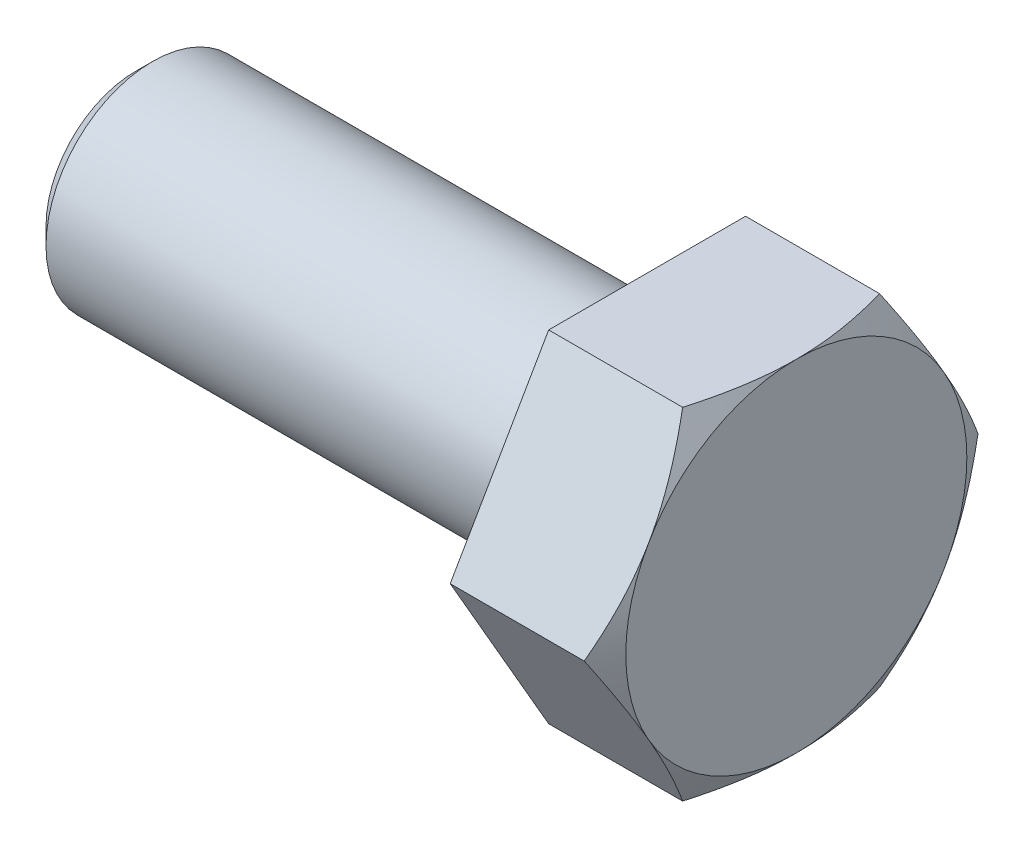
ISO-10303-21;
HEADER;
FILE_DESCRIPTION(('STEP AP214'),'2;1');
FILE_NAME('part.step','',(''),(''),'','','');
FILE_SCHEMA(('AUTOMOTIVE_DESIGN { 1 0 10303 214 1 1 1 1 }'));
ENDSEC;
DATA;
#1=APPLICATION_CONTEXT('core data for automotive mechanical design processes');
#2=APPLICATION_PROTOCOL_DEFINITION('international standard','automotive_design',2000,#1);
#3=PRODUCT_CONTEXT('',#1,'mechanical');
#4=PRODUCT('Part','Part','',(#3));
#5=PRODUCT_RELATED_PRODUCT_CATEGORY('part','',(#4));
#6=PRODUCT_DEFINITION_FORMATION('','',#4);
#7=PRODUCT_DEFINITION_CONTEXT('part definition',#1,'design');
#8=PRODUCT_DEFINITION('design','',#6,#7);
#9=PRODUCT_DEFINITION_SHAPE('','',#8);
#10=(LENGTH_UNIT() NAMED_UNIT(*) SI_UNIT(.MILLI.,.METRE.));
#11=(NAMED_UNIT(*) PLANE_ANGLE_UNIT() SI_UNIT($,.RADIAN.));
#12=(NAMED_UNIT(*) SI_UNIT($,.STERADIAN.) SOLID_ANGLE_UNIT());
#13=UNCERTAINTY_MEASURE_WITH_UNIT(LENGTH_MEASURE(1.E-05),#10,'distance_accuracy_value','');
#14=(GEOMETRIC_REPRESENTATION_CONTEXT(3) GLOBAL_UNCERTAINTY_ASSIGNED_CONTEXT((#13)) GLOBAL_UNIT_ASSIGNED_CONTEXT((#10,
#11,#12)) REPRESENTATION_CONTEXT('',''));
#15=CARTESIAN_POINT('',(0.,0.,0.));
#16=DIRECTION('',(0.,0.,1.));
#17=DIRECTION('',(1.,0.,0.));
#18=AXIS2_PLACEMENT_3D('',#15,#16,#17);
#19=CARTESIAN_POINT('',(0.,0.,0.));
#20=DIRECTION('',(1.,0.,0.));
#21=DIRECTION('',(0.,0.,-1.));
#22=AXIS2_PLACEMENT_3D('',#19,#20,#21);
#23=CYLINDRICAL_SURFACE('',#22,2.1);
#24=CARTESIAN_POINT('',(0.,0.,0.));
#25=DIRECTION('',(1.,0.,0.));
#26=DIRECTION('',(0.,0.,1.));
#27=AXIS2_PLACEMENT_3D('',#24,#25,#26);
#28=CIRCLE('',#27,2.1);
#29=CARTESIAN_POINT('',(0.,0.,2.1));
#30=VERTEX_POINT('',#29);
#31=EDGE_CURVE('P0_E11',#30,#30,#28,.T.);
#32=ORIENTED_EDGE('',*,*,#31,.T.);
#33=CARTESIAN_POINT('',(12.,0.,2.1));
#34=DIRECTION('',(-1.,0.,0.));
#35=VECTOR('',#34,1.);
#36=LINE('',#33,#35);
#37=CARTESIAN_POINT('',(12.,0.,2.1));
#38=VERTEX_POINT('',#37);
#39=EDGE_CURVE('P0_E24',#38,#30,#36,.T.);
#40=ORIENTED_EDGE('',*,*,#39,.F.);
#41=CARTESIAN_POINT('',(12.,0.,0.));
#42=DIRECTION('',(-1.,0.,0.));
#43=DIRECTION('',(0.,0.,1.));
#44=AXIS2_PLACEMENT_3D('',#41,#42,#43);
#45=CIRCLE('',#44,2.1);
#46=EDGE_CURVE('P0_E33',#38,#38,#45,.T.);
#47=ORIENTED_EDGE('',*,*,#46,.T.);
#48=ORIENTED_EDGE('',*,*,#39,.T.);
#49=EDGE_LOOP('',(#32,#40,#47,#48));
#50=FACE_BOUND('',#49,.T.);
#51=ADVANCED_FACE('P0_F16',(#50),#23,.T.);
#52=OPEN_SHELL('',(#51));
#53=SHELL_BASED_SURFACE_MODEL('P0_B1',(#52));
#54=CARTESIAN_POINT('',(15.5,0.,0.));
#55=DIRECTION('',(1.,0.,0.));
#56=DIRECTION('',(0.,1.,0.));
#57=AXIS2_PLACEMENT_3D('',#54,#55,#56);
#58=PLANE('',#57);
#59=CARTESIAN_POINT('',(15.4999999999745,0.,0.));
#60=DIRECTION('',(-1.,0.,0.));
#61=DIRECTION('',(0.,0.,1.));
#62=AXIS2_PLACEMENT_3D('',#59,#60,#61);
#63=CIRCLE('',#62,4.00000000004094);
#64=CARTESIAN_POINT('',(15.4999999999745,-4.00000000002047,-4.08001245358839E-08));
#65=VERTEX_POINT('',#64);
#66=CARTESIAN_POINT('',(15.4999999999745,-2.00000000025329,3.46410161501512));
#67=VERTEX_POINT('',#66);
#68=EDGE_CURVE('P1_E103',#65,#67,#63,.T.);
#69=ORIENTED_EDGE('',*,*,#68,.F.);
#70=CARTESIAN_POINT('',(15.4999999999745,0.,0.));
#71=DIRECTION('',(-1.,0.,0.));
#72=DIRECTION('',(0.,0.,1.));
#73=AXIS2_PLACEMENT_3D('',#70,#71,#72);
#74=CIRCLE('',#73,4.00000000004094);
#75=CARTESIAN_POINT('',(15.4999999999745,-2.00000002440245,-3.4641016010729));
#76=VERTEX_POINT('',#75);
#77=EDGE_CURVE('P1_E11',#76,#65,#74,.T.);
#78=ORIENTED_EDGE('',*,*,#77,.F.);
#79=CARTESIAN_POINT('',(15.4999999999745,0.,0.));
#80=DIRECTION('',(-1.,0.,0.));
#81=DIRECTION('',(0.,0.,1.));
#82=AXIS2_PLACEMENT_3D('',#79,#80,#81);
#83=CIRCLE('',#82,4.00000000004094);
#84=CARTESIAN_POINT('',(15.4999999999745,2.00000000025931,-3.46410161501165));
#85=VERTEX_POINT('',#84);
#86=EDGE_CURVE('P1_E30',#85,#76,#83,.T.);
#87=ORIENTED_EDGE('',*,*,#86,.F.);
#88=CARTESIAN_POINT('',(15.4999999999745,0.,0.));
#89=DIRECTION('',(-1.,0.,0.));
#90=DIRECTION('',(0.,0.,1.));
#91=AXIS2_PLACEMENT_3D('',#88,#89,#90);
#92=CIRCLE('',#91,4.00000000004094);
#93=CARTESIAN_POINT('',(15.4999999999745,4.00000000002047,-1.98022594919469E-11));
#94=VERTEX_POINT('',#93);
#95=EDGE_CURVE('P1_E161',#94,#85,#92,.T.);
#96=ORIENTED_EDGE('',*,*,#95,.F.);
#97=CARTESIAN_POINT('',(15.4999999999745,0.,0.));
#98=DIRECTION('',(-1.,0.,0.));
#99=DIRECTION('',(0.,0.,1.));
#100=AXIS2_PLACEMENT_3D('',#97,#98,#99);
#101=CIRCLE('',#100,4.00000000004094);
#102=CARTESIAN_POINT('',(15.4999999999745,2.00000003113124,3.46410159718804));
#103=VERTEX_POINT('',#102);
#104=EDGE_CURVE('P1_E112',#103,#94,#101,.T.);
#105=ORIENTED_EDGE('',*,*,#104,.F.);
#106=CARTESIAN_POINT('',(15.4999999999745,0.,0.));
#107=DIRECTION('',(-1.,0.,0.));
#108=DIRECTION('',(0.,0.,1.));
#109=AXIS2_PLACEMENT_3D('',#106,#107,#108);
#110=CIRCLE('',#109,4.00000000004094);
#111=EDGE_CURVE('P1_E208',#67,#103,#110,.T.);
#112=ORIENTED_EDGE('',*,*,#111,.F.);
#113=EDGE_LOOP('',(#69,#78,#87,#96,#105,#112));
#114=FACE_BOUND('',#113,.T.);
#115=ADVANCED_FACE('P1_F17',(#114),#58,.T.);
#116=CARTESIAN_POINT('',(15.140590816543,0.,0.));
#117=DIRECTION('',(-1.,0.,0.));
#118=DIRECTION('',(0.,0.,1.));
#119=AXIS2_PLACEMENT_3D('',#116,#117,#118);
#120=CONICAL_SURFACE('',#119,4.62251496641922,1.0471975511743);
#121=CARTESIAN_POINT('',(15.1427344100675,-4.,-2.30940107677274));
#122=CARTESIAN_POINT('',(15.4999999936864,-4.,-1.07179679159493));
#123=CARTESIAN_POINT('',(15.4999999999982,-4.,-4.08001136873754E-08));
#124=(BOUNDED_CURVE() B_SPLINE_CURVE(2,(#121,#122,#123),.UNSPECIFIED.,.F.,
.F.) B_SPLINE_CURVE_WITH_KNOTS((3,3),(0.740616445840215,1.19730458523065),
.UNSPECIFIED.) CURVE() GEOMETRIC_REPRESENTATION_ITEM() RATIONAL_B_SPLINE_CURVE((1.83253175468209,
1.97427857650898,1.97427857920692)) REPRESENTATION_ITEM(''));
#125=CARTESIAN_POINT('',(15.1427344100722,-4.,-2.30940107675653));
#126=VERTEX_POINT('',#125);
#127=EDGE_CURVE('P1_E293',#126,#65,#124,.T.);
#128=ORIENTED_EDGE('',*,*,#127,.F.);
#129=CARTESIAN_POINT('',(15.4999999999979,-2.00000002439234,-3.46410160105538));
#130=CARTESIAN_POINT('',(15.4999999956407,-2.92820324335333,-2.92820322272555));
#131=CARTESIAN_POINT('',(15.1427344100665,-4.00000000001487,-2.30940107675042));
#132=(BOUNDED_CURVE() B_SPLINE_CURVE(2,(#129,#130,#131),.UNSPECIFIED.,.F.,
.F.) B_SPLINE_CURVE_WITH_KNOTS((3,3),(1.1973045999236,1.65399274200623),
.UNSPECIFIED.) CURVE() GEOMETRIC_REPRESENTATION_ITEM() RATIONAL_B_SPLINE_CURVE((1.97427857920674,
1.97427857734428,1.83253175468168)) REPRESENTATION_ITEM(''));
#133=EDGE_CURVE('P1_E236',#76,#126,#132,.T.);
#134=ORIENTED_EDGE('',*,*,#133,.F.);
#135=ORIENTED_EDGE('',*,*,#77,.T.);
#136=EDGE_LOOP('',(#128,#134,#135));
#137=FACE_BOUND('',#136,.T.);
#138=ADVANCED_FACE('P1_F340',(#137),#120,.T.);
#139=CARTESIAN_POINT('',(15.140590816543,0.,0.));
#140=DIRECTION('',(-1.,0.,0.));
#141=DIRECTION('',(0.,-3.48139460559074E-09,-1.));
#142=AXIS2_PLACEMENT_3D('',#139,#140,#141);
#143=CONICAL_SURFACE('',#142,4.62251496641922,1.0471975511743);
#144=CARTESIAN_POINT('',(15.4999999999982,2.00000000027226,-3.46410161498051));
#145=CARTESIAN_POINT('',(15.5000000000468,1.07179676986435,-3.99999999991922));
#146=CARTESIAN_POINT('',(15.1427344100666,-1.50662984120474E-11,-4.6188021535257));
#147=(BOUNDED_CURVE() B_SPLINE_CURVE(2,(#144,#145,#146),.UNSPECIFIED.,.F.,
.F.) B_SPLINE_CURVE_WITH_KNOTS((3,3),(1.19730459385607,1.65399274200641),
.UNSPECIFIED.) CURVE() GEOMETRIC_REPRESENTATION_ITEM() RATIONAL_B_SPLINE_CURVE((1.97427857920694,
1.97427857922773,1.83253175468176)) REPRESENTATION_ITEM(''));
#148=CARTESIAN_POINT('',(15.1427344100722,-2.28304729963317E-12,-4.61880215351598));
#149=VERTEX_POINT('',#148);
#150=EDGE_CURVE('P1_E176',#85,#149,#147,.T.);
#151=ORIENTED_EDGE('',*,*,#150,.F.);
#152=ORIENTED_EDGE('',*,*,#86,.T.);
#153=CARTESIAN_POINT('',(15.1427344100674,1.15974947017943E-11,-4.6188021535243));
#154=CARTESIAN_POINT('',(15.5000000043551,-1.07179678279165,-3.99999999245625));
#155=CARTESIAN_POINT('',(15.4999999999979,-2.00000002439234,-3.46410160105538));
#156=(BOUNDED_CURVE() B_SPLINE_CURVE(2,(#153,#154,#155),.UNSPECIFIED.,.F.,
.F.) B_SPLINE_CURVE_WITH_KNOTS((3,3),(0.740616445840306,1.1973045999236),
.UNSPECIFIED.) CURVE() GEOMETRIC_REPRESENTATION_ITEM() RATIONAL_B_SPLINE_CURVE((1.83253175468201,
1.97427858106921,1.97427857920674)) REPRESENTATION_ITEM(''));
#157=EDGE_CURVE('P1_E179',#149,#76,#156,.T.);
#158=ORIENTED_EDGE('',*,*,#157,.F.);
#159=EDGE_LOOP('',(#151,#152,#158));
#160=FACE_BOUND('',#159,.T.);
#161=ADVANCED_FACE('P1_F177',(#160),#143,.T.);
#162=CARTESIAN_POINT('',(15.140590816543,0.,0.));
#163=DIRECTION('',(-1.,0.,0.));
#164=DIRECTION('',(0.,0.,1.));
#165=AXIS2_PLACEMENT_3D('',#162,#163,#164);
#166=CONICAL_SURFACE('',#165,4.62251496641922,1.0471975511743);
#167=CARTESIAN_POINT('',(15.4999999999982,4.,-2.93993260822995E-11));
#168=CARTESIAN_POINT('',(15.4999999999936,4.,-1.07179676974724));
#169=CARTESIAN_POINT('',(15.1427344100666,4.,-2.30940107677591));
#170=(BOUNDED_CURVE() B_SPLINE_CURVE(2,(#167,#168,#169),.UNSPECIFIED.,.F.,
.F.) B_SPLINE_CURVE_WITH_KNOTS((3,3),(1.19730459392929,1.65399274200639),
.UNSPECIFIED.) CURVE() GEOMETRIC_REPRESENTATION_ITEM() RATIONAL_B_SPLINE_CURVE((1.97427857920692,
1.97427857920498,1.83253175468176)) REPRESENTATION_ITEM(''));
#171=CARTESIAN_POINT('',(15.1427344100723,3.99999999999776,-2.30940107675999));
#172=VERTEX_POINT('',#171);
#173=EDGE_CURVE('P1_E171',#94,#172,#170,.T.);
#174=ORIENTED_EDGE('',*,*,#173,.F.);
#175=ORIENTED_EDGE('',*,*,#95,.T.);
#176=CARTESIAN_POINT('',(15.1427344100677,4.0000000000117,-2.30940107675164));
#177=CARTESIAN_POINT('',(15.4999999999496,2.92820323042612,-2.92820323018847));
#178=CARTESIAN_POINT('',(15.4999999999982,2.00000000027226,-3.46410161498051));
#179=(BOUNDED_CURVE() B_SPLINE_CURVE(2,(#176,#177,#178),.UNSPECIFIED.,.F.,
.F.) B_SPLINE_CURVE_WITH_KNOTS((3,3),(0.740616445840341,1.19730459385607),
.UNSPECIFIED.) CURVE() GEOMETRIC_REPRESENTATION_ITEM() RATIONAL_B_SPLINE_CURVE((1.83253175468219,
1.97427857918615,1.97427857920694)) REPRESENTATION_ITEM(''));
#180=EDGE_CURVE('P1_E170',#172,#85,#179,.T.);
#181=ORIENTED_EDGE('',*,*,#180,.F.);
#182=EDGE_LOOP('',(#174,#175,#181));
#183=FACE_BOUND('',#182,.T.);
#184=ADVANCED_FACE('P1_F168',(#183),#166,.T.);
#185=CARTESIAN_POINT('',(15.140590816543,0.,0.));
#186=DIRECTION('',(-1.,0.,0.));
#187=DIRECTION('',(0.,0.,1.));
#188=AXIS2_PLACEMENT_3D('',#185,#186,#187);
#189=CONICAL_SURFACE('',#188,4.62251496641922,1.0471975511743);
#190=CARTESIAN_POINT('',(15.1427344100675,4.,2.30940107677274));
#191=CARTESIAN_POINT('',(15.5000000000027,4.,1.07179676971446));
#192=CARTESIAN_POINT('',(15.4999999999982,4.,-2.93993260822995E-11));
#193=(BOUNDED_CURVE() B_SPLINE_CURVE(2,(#190,#191,#192),.UNSPECIFIED.,.F.,
.F.) B_SPLINE_CURVE_WITH_KNOTS((3,3),(0.740616445840215,1.19730459392929),
.UNSPECIFIED.) CURVE() GEOMETRIC_REPRESENTATION_ITEM() RATIONAL_B_SPLINE_CURVE((1.83253175468209,
1.97427857920886,1.97427857920692)) REPRESENTATION_ITEM(''));
#194=CARTESIAN_POINT('',(15.1427344100722,4.,2.30940107675653));
#195=VERTEX_POINT('',#194);
#196=EDGE_CURVE('P1_E273',#195,#94,#193,.T.);
#197=ORIENTED_EDGE('',*,*,#196,.F.);
#198=CARTESIAN_POINT('',(15.4999999999979,2.00000003112112,3.46410159717052));
#199=CARTESIAN_POINT('',(15.4999999944387,2.92820324695928,2.92820322064366));
#200=CARTESIAN_POINT('',(15.1427344100665,4.00000000001487,2.30940107675042));
#201=(BOUNDED_CURVE() B_SPLINE_CURVE(2,(#198,#199,#200),.UNSPECIFIED.,.F.,
.F.) B_SPLINE_CURVE_WITH_KNOTS((3,3),(1.19730460157893,1.65399274200623),
.UNSPECIFIED.) CURVE() GEOMETRIC_REPRESENTATION_ITEM() RATIONAL_B_SPLINE_CURVE((1.97427857920674,
1.9742785768305,1.83253175468168)) REPRESENTATION_ITEM(''));
#202=EDGE_CURVE('P1_E258',#103,#195,#201,.T.);
#203=ORIENTED_EDGE('',*,*,#202,.F.);
#204=ORIENTED_EDGE('',*,*,#104,.T.);
#205=EDGE_LOOP('',(#197,#203,#204));
#206=FACE_BOUND('',#205,.T.);
#207=ADVANCED_FACE('P1_F354',(#206),#189,.T.);
#208=CARTESIAN_POINT('',(15.140590816543,0.,0.));
#209=DIRECTION('',(-1.,0.,0.));
#210=DIRECTION('',(0.,0.,1.));
#211=AXIS2_PLACEMENT_3D('',#208,#209,#210);
#212=CONICAL_SURFACE('',#211,4.62251496641922,1.0471975511743);
#213=CARTESIAN_POINT('',(15.4999999999982,-4.,-4.08001136873754E-08));
#214=CARTESIAN_POINT('',(15.50000000631,-4.,1.07179674786572));
#215=CARTESIAN_POINT('',(15.1427344100673,-4.,2.3094010767733));
#216=(BOUNDED_CURVE() B_SPLINE_CURVE(2,(#213,#214,#215),.UNSPECIFIED.,.F.,
.F.) B_SPLINE_CURVE_WITH_KNOTS((3,3),(1.19730458523065,1.65399274200594),
.UNSPECIFIED.) CURVE() GEOMETRIC_REPRESENTATION_ITEM() RATIONAL_B_SPLINE_CURVE((1.97427857920692,
1.97427858190486,1.83253175468203)) REPRESENTATION_ITEM(''));
#217=CARTESIAN_POINT('',(15.142734410073,-3.99999999999776,2.30940107675739));
#218=VERTEX_POINT('',#217);
#219=EDGE_CURVE('P1_E137',#65,#218,#216,.T.);
#220=ORIENTED_EDGE('',*,*,#219,.F.);
#221=ORIENTED_EDGE('',*,*,#68,.T.);
#222=CARTESIAN_POINT('',(15.1427344100674,-4.00000000001257,2.30940107675114));
#223=CARTESIAN_POINT('',(15.4999999999512,-2.92820323042168,2.92820323019104));
#224=CARTESIAN_POINT('',(15.4999999999982,-2.00000000026334,3.46410161498566));
#225=(BOUNDED_CURVE() B_SPLINE_CURVE(2,(#222,#223,#224),.UNSPECIFIED.,.F.,
.F.) B_SPLINE_CURVE_WITH_KNOTS((3,3),(0.740616445840171,1.19730459385826),
.UNSPECIFIED.) CURVE() GEOMETRIC_REPRESENTATION_ITEM() RATIONAL_B_SPLINE_CURVE((1.83253175468208,
1.97427857918684,1.97427857920694)) REPRESENTATION_ITEM(''));
#226=EDGE_CURVE('P1_E249',#218,#67,#225,.T.);
#227=ORIENTED_EDGE('',*,*,#226,.F.);
#228=EDGE_LOOP('',(#220,#221,#227));
#229=FACE_BOUND('',#228,.T.);
#230=ADVANCED_FACE('P1_F356',(#229),#212,.T.);
#231=CARTESIAN_POINT('',(0.,0.,0.));
#232=DIRECTION('',(-1.,0.,0.));
#233=DIRECTION('',(0.,0.,1.));
#234=AXIS2_PLACEMENT_3D('',#231,#232,#233);
#235=PLANE('',#234);
#236=CARTESIAN_POINT('',(0.,0.,0.));
#237=DIRECTION('',(1.,0.,0.));
#238=DIRECTION('',(0.,0.,-1.));
#239=AXIS2_PLACEMENT_3D('',#236,#237,#238);
#240=CIRCLE('',#239,2.09999999998445);
#241=CARTESIAN_POINT('',(0.,0.,2.09999999998445));
#242=VERTEX_POINT('',#241);
#243=EDGE_CURVE('P1_E212',#242,#242,#240,.T.);
#244=ORIENTED_EDGE('',*,*,#243,.F.);
#245=EDGE_LOOP('',(#244));
#246=FACE_BOUND('',#245,.T.);
#247=ADVANCED_FACE('P1_F363',(#246),#235,.T.);
#248=CARTESIAN_POINT('',(12.,-4.,0.));
#249=DIRECTION('',(0.,-1.,0.));
#250=DIRECTION('',(0.,0.,-1.));
#251=AXIS2_PLACEMENT_3D('',#248,#249,#250);
#252=PLANE('',#251);
#253=DIRECTION('',(-1.,0.,0.));
#254=VECTOR('',#253,1.);
#255=CARTESIAN_POINT('',(12.,-4.,-2.309401076759));
#256=LINE('',#255,#254);
#257=CARTESIAN_POINT('',(12.,-4.,-2.309401076759));
#258=VERTEX_POINT('',#257);
#259=EDGE_CURVE('P1_E241',#126,#258,#256,.T.);
#260=ORIENTED_EDGE('',*,*,#259,.F.);
#261=ORIENTED_EDGE('',*,*,#127,.T.);
#262=ORIENTED_EDGE('',*,*,#219,.T.);
#263=DIRECTION('',(1.,0.,0.));
#264=VECTOR('',#263,1.);
#265=CARTESIAN_POINT('',(12.,-3.99999999999974,2.30940107675854));
#266=LINE('',#265,#264);
#267=CARTESIAN_POINT('',(12.,-3.99999999999974,2.30940107675854));
#268=VERTEX_POINT('',#267);
#269=EDGE_CURVE('P1_E146',#268,#218,#266,.T.);
#270=ORIENTED_EDGE('',*,*,#269,.F.);
#271=DIRECTION('',(0.,0.,-1.));
#272=VECTOR('',#271,1.);
#273=CARTESIAN_POINT('',(12.,-4.,0.));
#274=LINE('',#273,#272);
#275=EDGE_CURVE('P1_E226',#268,#258,#274,.T.);
#276=ORIENTED_EDGE('',*,*,#275,.T.);
#277=EDGE_LOOP('',(#260,#261,#262,#270,#276));
#278=FACE_BOUND('',#277,.T.);
#279=ADVANCED_FACE('P1_F339',(#278),#252,.T.);
#280=CARTESIAN_POINT('',(12.,-4.,-2.309401076759));
#281=DIRECTION('',(0.,-0.500000000000017,-0.866025403784429));
#282=DIRECTION('',(0.,-0.866025403784429,0.500000000000017));
#283=AXIS2_PLACEMENT_3D('',#280,#281,#282);
#284=PLANE('',#283);
#285=DIRECTION('',(-1.,0.,0.));
#286=VECTOR('',#285,1.);
#287=CARTESIAN_POINT('',(12.,0.,-4.618802153517));
#288=LINE('',#287,#286);
#289=CARTESIAN_POINT('',(12.,0.,-4.61880215351706));
#290=VERTEX_POINT('',#289);
#291=EDGE_CURVE('P1_E183',#149,#290,#288,.T.);
#292=ORIENTED_EDGE('',*,*,#291,.F.);
#293=ORIENTED_EDGE('',*,*,#157,.T.);
#294=ORIENTED_EDGE('',*,*,#133,.T.);
#295=ORIENTED_EDGE('',*,*,#259,.T.);
#296=DIRECTION('',(0.,0.866025403784486,-0.499999999999918));
#297=VECTOR('',#296,1.);
#298=CARTESIAN_POINT('',(12.,-4.,-2.309401076759));
#299=LINE('',#298,#297);
#300=EDGE_CURVE('P1_E207',#258,#290,#299,.T.);
#301=ORIENTED_EDGE('',*,*,#300,.T.);
#302=EDGE_LOOP('',(#292,#293,#294,#295,#301));
#303=FACE_BOUND('',#302,.T.);
#304=ADVANCED_FACE('P1_F342',(#303),#284,.T.);
#305=CARTESIAN_POINT('',(12.,0.,-4.618802153517));
#306=DIRECTION('',(0.,0.500000000000017,-0.866025403784429));
#307=DIRECTION('',(-1.,0.,0.));
#308=AXIS2_PLACEMENT_3D('',#305,#306,#307);
#309=PLANE('',#308);
#310=DIRECTION('',(-1.,0.,0.));
#311=VECTOR('',#310,1.);
#312=CARTESIAN_POINT('',(12.,4.,-2.309401076759));
#313=LINE('',#312,#311);
#314=CARTESIAN_POINT('',(12.,4.,-2.30940107675889));
#315=VERTEX_POINT('',#314);
#316=EDGE_CURVE('P1_E80',#172,#315,#313,.T.);
#317=ORIENTED_EDGE('',*,*,#316,.F.);
#318=ORIENTED_EDGE('',*,*,#180,.T.);
#319=ORIENTED_EDGE('',*,*,#150,.T.);
#320=ORIENTED_EDGE('',*,*,#291,.T.);
#321=DIRECTION('',(0.,0.866025403784486,0.499999999999918));
#322=VECTOR('',#321,1.);
#323=CARTESIAN_POINT('',(12.,0.,-4.618802153517));
#324=LINE('',#323,#322);
#325=EDGE_CURVE('P1_E203',#290,#315,#324,.T.);
#326=ORIENTED_EDGE('',*,*,#325,.T.);
#327=EDGE_LOOP('',(#317,#318,#319,#320,#326));
#328=FACE_BOUND('',#327,.T.);
#329=ADVANCED_FACE('P1_F185',(#328),#309,.T.);
#330=CARTESIAN_POINT('',(12.,4.,-2.309401076759));
#331=DIRECTION('',(0.,1.,0.));
#332=DIRECTION('',(1.,0.,0.));
#333=AXIS2_PLACEMENT_3D('',#330,#331,#332);
#334=PLANE('',#333);
#335=DIRECTION('',(-1.,0.,0.));
#336=VECTOR('',#335,1.);
#337=CARTESIAN_POINT('',(12.,4.,2.309401076759));
#338=LINE('',#337,#336);
#339=CARTESIAN_POINT('',(12.,4.,2.309401076759));
#340=VERTEX_POINT('',#339);
#341=EDGE_CURVE('P1_E281',#195,#340,#338,.T.);
#342=ORIENTED_EDGE('',*,*,#341,.F.);
#343=ORIENTED_EDGE('',*,*,#196,.T.);
#344=ORIENTED_EDGE('',*,*,#173,.T.);
#345=ORIENTED_EDGE('',*,*,#316,.T.);
#346=DIRECTION('',(0.,0.,1.));
#347=VECTOR('',#346,1.);
#348=CARTESIAN_POINT('',(12.,4.,0.));
#349=LINE('',#348,#347);
#350=EDGE_CURVE('P1_E197',#315,#340,#349,.T.);
#351=ORIENTED_EDGE('',*,*,#350,.T.);
#352=EDGE_LOOP('',(#342,#343,#344,#345,#351));
#353=FACE_BOUND('',#352,.T.);
#354=ADVANCED_FACE('P1_F350',(#353),#334,.T.);
#355=CARTESIAN_POINT('',(12.,4.,2.309401076759));
#356=DIRECTION('',(0.,0.500000000000017,0.866025403784429));
#357=DIRECTION('',(1.,0.,0.));
#358=AXIS2_PLACEMENT_3D('',#355,#356,#357);
#359=PLANE('',#358);
#360=DIRECTION('',(-1.,0.,0.));
#361=VECTOR('',#360,1.);
#362=CARTESIAN_POINT('',(12.,0.,4.618802153517));
#363=LINE('',#362,#361);
#364=CARTESIAN_POINT('',(15.1427344100722,2.26486070181931E-12,4.618802153516));
#365=VERTEX_POINT('',#364);
#366=CARTESIAN_POINT('',(12.,0.,4.61880215351706));
#367=VERTEX_POINT('',#366);
#368=EDGE_CURVE('P1_E92',#365,#367,#363,.T.);
#369=ORIENTED_EDGE('',*,*,#368,.F.);
#370=CARTESIAN_POINT('',(15.1427344100674,-1.16166392800471E-11,4.61880215352431));
#371=CARTESIAN_POINT('',(15.5000000055571,1.07179678639758,3.99999999037436));
#372=CARTESIAN_POINT('',(15.4999999999979,2.00000003112112,3.46410159717052));
#373=(BOUNDED_CURVE() B_SPLINE_CURVE(2,(#370,#371,#372),.UNSPECIFIED.,.F.,
.F.) B_SPLINE_CURVE_WITH_KNOTS((3,3),(0.740616445840302,1.19730460157893),
.UNSPECIFIED.) CURVE() GEOMETRIC_REPRESENTATION_ITEM() RATIONAL_B_SPLINE_CURVE((1.83253175468201,
1.97427858158299,1.97427857920674)) REPRESENTATION_ITEM(''));
#374=EDGE_CURVE('P1_E21',#365,#103,#373,.T.);
#375=ORIENTED_EDGE('',*,*,#374,.T.);
#376=ORIENTED_EDGE('',*,*,#202,.T.);
#377=ORIENTED_EDGE('',*,*,#341,.T.);
#378=DIRECTION('',(0.,-0.866025403784486,0.499999999999918));
#379=VECTOR('',#378,1.);
#380=CARTESIAN_POINT('',(12.,4.,2.309401076759));
#381=LINE('',#380,#379);
#382=EDGE_CURVE('P1_E204',#340,#367,#381,.T.);
#383=ORIENTED_EDGE('',*,*,#382,.T.);
#384=EDGE_LOOP('',(#369,#375,#376,#377,#383));
#385=FACE_BOUND('',#384,.T.);
#386=ADVANCED_FACE('P1_F351',(#385),#359,.T.);
#387=CARTESIAN_POINT('',(12.,0.,4.618802153517));
#388=DIRECTION('',(0.,-0.500000000000017,0.866025403784429));
#389=DIRECTION('',(-1.,0.,0.));
#390=AXIS2_PLACEMENT_3D('',#387,#388,#389);
#391=PLANE('',#390);
#392=ORIENTED_EDGE('',*,*,#269,.T.);
#393=ORIENTED_EDGE('',*,*,#226,.T.);
#394=CARTESIAN_POINT('',(15.4999999999982,-2.00000000026333,3.46410161498566));
#395=CARTESIAN_POINT('',(15.5000000000452,-1.07179676985956,3.99999999992199));
#396=CARTESIAN_POINT('',(15.1427344100666,1.5071145140719E-11,4.6188021535257));
#397=(BOUNDED_CURVE() B_SPLINE_CURVE(2,(#394,#395,#396),.UNSPECIFIED.,.F.,
.F.) B_SPLINE_CURVE_WITH_KNOTS((3,3),(-1.19730459398781,-0.740616445839659),
.UNSPECIFIED.) CURVE() GEOMETRIC_REPRESENTATION_ITEM() RATIONAL_B_SPLINE_CURVE((1.97427857920694,
1.97427857922704,1.83253175468176)) REPRESENTATION_ITEM(''));
#398=EDGE_CURVE('P1_E235',#67,#365,#397,.T.);
#399=ORIENTED_EDGE('',*,*,#398,.T.);
#400=ORIENTED_EDGE('',*,*,#368,.T.);
#401=DIRECTION('',(0.,-0.866025403784486,-0.499999999999918));
#402=VECTOR('',#401,1.);
#403=CARTESIAN_POINT('',(12.,0.,4.618802153517));
#404=LINE('',#403,#402);
#405=EDGE_CURVE('P1_E246',#367,#268,#404,.T.);
#406=ORIENTED_EDGE('',*,*,#405,.T.);
#407=EDGE_LOOP('',(#392,#393,#399,#400,#406));
#408=FACE_BOUND('',#407,.T.);
#409=ADVANCED_FACE('P1_F386',(#408),#391,.T.);
#410=CARTESIAN_POINT('',(12.,0.,0.));
#411=DIRECTION('',(1.,0.,0.));
#412=DIRECTION('',(0.,1.,0.));
#413=AXIS2_PLACEMENT_3D('',#410,#411,#412);
#414=PLANE('',#413);
#415=CARTESIAN_POINT('',(12.,0.,0.));
#416=DIRECTION('',(-1.,0.,0.));
#417=DIRECTION('',(0.,0.,1.));
#418=AXIS2_PLACEMENT_3D('',#415,#416,#417);
#419=CIRCLE('',#418,2.5);
#420=CARTESIAN_POINT('',(12.,0.,-2.5));
#421=VERTEX_POINT('',#420);
#422=EDGE_CURVE('P1_E217',#421,#421,#419,.T.);
#423=ORIENTED_EDGE('',*,*,#422,.F.);
#424=EDGE_LOOP('',(#423));
#425=FACE_BOUND('',#424,.T.);
#426=ORIENTED_EDGE('',*,*,#382,.F.);
#427=ORIENTED_EDGE('',*,*,#350,.F.);
#428=ORIENTED_EDGE('',*,*,#325,.F.);
#429=ORIENTED_EDGE('',*,*,#300,.F.);
#430=ORIENTED_EDGE('',*,*,#275,.F.);
#431=ORIENTED_EDGE('',*,*,#405,.F.);
#432=EDGE_LOOP('',(#426,#427,#428,#429,#430,#431));
#433=FACE_BOUND('',#432,.T.);
#434=ADVANCED_FACE('P1_F348',(#425,#433),#414,.F.);
#435=CARTESIAN_POINT('',(15.140590816543,0.,0.));
#436=DIRECTION('',(-1.,0.,0.));
#437=DIRECTION('',(0.,0.,1.));
#438=AXIS2_PLACEMENT_3D('',#435,#436,#437);
#439=CONICAL_SURFACE('',#438,4.62251496641922,1.0471975511743);
#440=ORIENTED_EDGE('',*,*,#111,.T.);
#441=ORIENTED_EDGE('',*,*,#374,.F.);
#442=ORIENTED_EDGE('',*,*,#398,.F.);
#443=EDGE_LOOP('',(#440,#441,#442));
#444=FACE_BOUND('',#443,.T.);
#445=ADVANCED_FACE('P1_F393',(#444),#439,.T.);
#446=CARTESIAN_POINT('',(0.399999999899592,0.,0.));
#447=DIRECTION('',(1.,0.,0.));
#448=DIRECTION('',(0.,0.,-1.));
#449=AXIS2_PLACEMENT_3D('',#446,#447,#448);
#450=CONICAL_SURFACE('',#449,2.49999999988404,0.785398163397448);
#451=CARTESIAN_POINT('',(0.4,0.,0.));
#452=DIRECTION('',(1.,0.,0.));
#453=DIRECTION('',(0.,0.,1.));
#454=AXIS2_PLACEMENT_3D('',#451,#452,#453);
#455=CIRCLE('',#454,2.5);
#456=CARTESIAN_POINT('',(0.4,0.,2.49999999998445));
#457=VERTEX_POINT('',#456);
#458=CARTESIAN_POINT('',(0.4,0.,-2.5));
#459=VERTEX_POINT('',#458);
#460=EDGE_CURVE('P1_E218',#457,#459,#455,.T.);
#461=ORIENTED_EDGE('',*,*,#460,.F.);
#462=DIRECTION('',(-0.707106781186548,0.,-0.707106781186548));
#463=VECTOR('',#462,1.);
#464=CARTESIAN_POINT('',(0.399999999899592,0.,2.49999999988404));
#465=LINE('',#464,#463);
#466=EDGE_CURVE('P1_E223',#457,#242,#465,.T.);
#467=ORIENTED_EDGE('',*,*,#466,.T.);
#468=ORIENTED_EDGE('',*,*,#243,.T.);
#469=ORIENTED_EDGE('',*,*,#466,.F.);
#470=CARTESIAN_POINT('',(0.4,0.,0.));
#471=DIRECTION('',(1.,0.,0.));
#472=DIRECTION('',(0.,0.,1.));
#473=AXIS2_PLACEMENT_3D('',#470,#471,#472);
#474=CIRCLE('',#473,2.5);
#475=EDGE_CURVE('P1_E219',#459,#457,#474,.T.);
#476=ORIENTED_EDGE('',*,*,#475,.F.);
#477=EDGE_LOOP('',(#461,#467,#468,#469,#476));
#478=FACE_BOUND('',#477,.T.);
#479=ADVANCED_FACE('P1_F19',(#478),#450,.T.);
#480=CARTESIAN_POINT('',(12.6,0.,0.));
#481=DIRECTION('',(-1.,0.,0.));
#482=DIRECTION('',(0.,0.,1.));
#483=AXIS2_PLACEMENT_3D('',#480,#481,#482);
#484=CYLINDRICAL_SURFACE('',#483,2.5);
#485=ORIENTED_EDGE('',*,*,#460,.T.);
#486=DIRECTION('',(1.,0.,0.));
#487=VECTOR('',#486,1.);
#488=CARTESIAN_POINT('',(12.6,0.,-2.5));
#489=LINE('',#488,#487);
#490=EDGE_CURVE('P1_E213',#459,#421,#489,.T.);
#491=ORIENTED_EDGE('',*,*,#490,.T.);
#492=ORIENTED_EDGE('',*,*,#422,.T.);
#493=ORIENTED_EDGE('',*,*,#490,.F.);
#494=ORIENTED_EDGE('',*,*,#475,.T.);
#495=EDGE_LOOP('',(#485,#491,#492,#493,#494));
#496=FACE_BOUND('',#495,.T.);
#497=ADVANCED_FACE('P1_F376',(#496),#484,.T.);
#498=CLOSED_SHELL('',(#115,#138,#161,#184,#207,#230,#247,#279,#304,#329,#354,#386,#409,#434,
#445,#479,#497));
#499=MANIFOLD_SOLID_BREP('P1_B1',#498);
#500=ADVANCED_BREP_SHAPE_REPRESENTATION('',(#18,#499),#14);
#501=MANIFOLD_SURFACE_SHAPE_REPRESENTATION('',(#18,#53),#14);
#502=SHAPE_REPRESENTATION('',(#18),#14);
#503=SHAPE_DEFINITION_REPRESENTATION(#9,#502);
#504=SHAPE_REPRESENTATION_RELATIONSHIP('','',#502,#500);
#505=SHAPE_REPRESENTATION_RELATIONSHIP('','',#502,#501);
ENDSEC;
END-ISO-10303-21;
